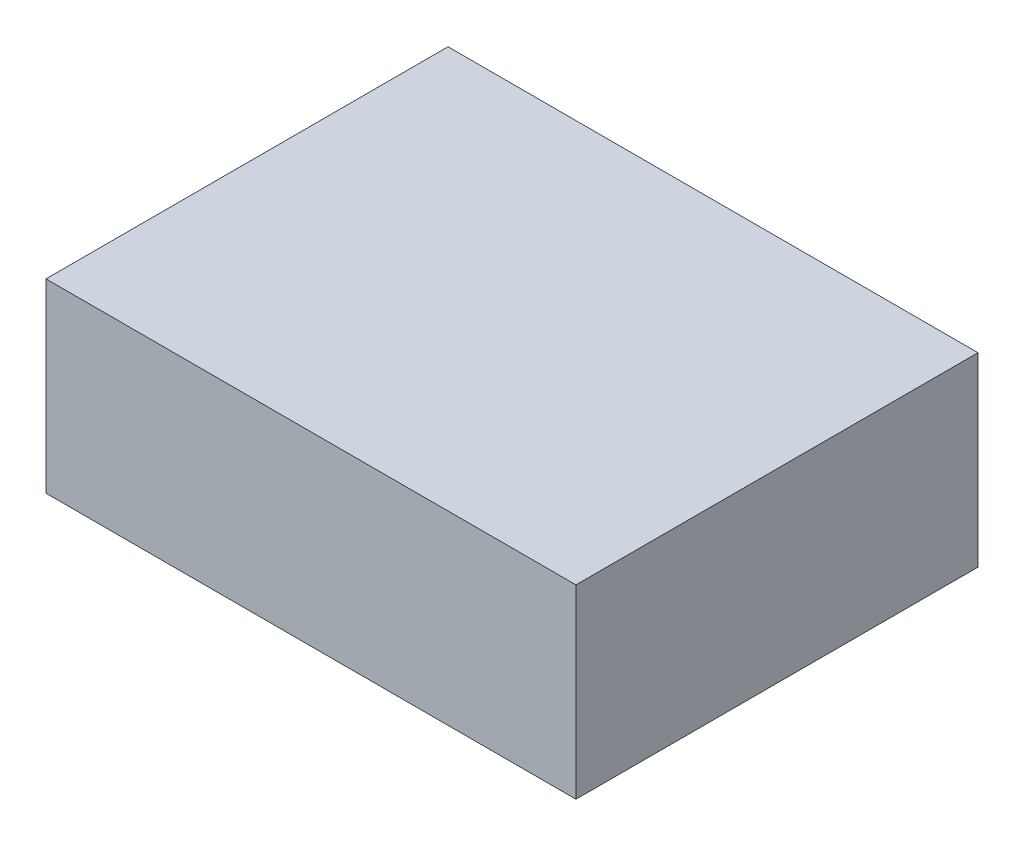
ISO-10303-21;
HEADER;
FILE_DESCRIPTION(('STEP AP214'),'2;1');
FILE_NAME('part.step','',(''),(''),'','','');
FILE_SCHEMA(('AUTOMOTIVE_DESIGN { 1 0 10303 214 1 1 1 1 }'));
ENDSEC;
DATA;
#1=APPLICATION_CONTEXT('core data for automotive mechanical design processes');
#2=APPLICATION_PROTOCOL_DEFINITION('international standard','automotive_design',2000,#1);
#3=PRODUCT_CONTEXT('',#1,'mechanical');
#4=PRODUCT('Part','Part','',(#3));
#5=PRODUCT_RELATED_PRODUCT_CATEGORY('part','',(#4));
#6=PRODUCT_DEFINITION_FORMATION('','',#4);
#7=PRODUCT_DEFINITION_CONTEXT('part definition',#1,'design');
#8=PRODUCT_DEFINITION('design','',#6,#7);
#9=PRODUCT_DEFINITION_SHAPE('','',#8);
#10=(LENGTH_UNIT() NAMED_UNIT(*) SI_UNIT(.MILLI.,.METRE.));
#11=(NAMED_UNIT(*) PLANE_ANGLE_UNIT() SI_UNIT($,.RADIAN.));
#12=(NAMED_UNIT(*) SI_UNIT($,.STERADIAN.) SOLID_ANGLE_UNIT());
#13=UNCERTAINTY_MEASURE_WITH_UNIT(LENGTH_MEASURE(1.E-05),#10,'distance_accuracy_value','');
#14=(GEOMETRIC_REPRESENTATION_CONTEXT(3) GLOBAL_UNCERTAINTY_ASSIGNED_CONTEXT((#13)) GLOBAL_UNIT_ASSIGNED_CONTEXT((#10,
#11,#12)) REPRESENTATION_CONTEXT('',''));
#15=CARTESIAN_POINT('',(0.,0.,0.));
#16=DIRECTION('',(0.,0.,1.));
#17=DIRECTION('',(1.,0.,0.));
#18=AXIS2_PLACEMENT_3D('',#15,#16,#17);
#19=CARTESIAN_POINT('',(-0.72499982,-0.254,0.));
#20=DIRECTION('',(0.,1.,0.));
#21=DIRECTION('',(0.,0.,1.));
#22=AXIS2_PLACEMENT_3D('',#19,#20,#21);
#23=PLANE('',#22);
#24=DIRECTION('',(0.,0.,1.));
#25=VECTOR('',#24,1.);
#26=CARTESIAN_POINT('',(0.72499982,-0.254,0.));
#27=LINE('',#26,#25);
#28=CARTESIAN_POINT('',(0.72499982,-0.254,0.));
#29=VERTEX_POINT('',#28);
#30=CARTESIAN_POINT('',(0.72499982,-0.254,1.10000034));
#31=VERTEX_POINT('',#30);
#32=EDGE_CURVE('E20',#29,#31,#27,.T.);
#33=ORIENTED_EDGE('',*,*,#32,.T.);
#34=DIRECTION('',(-1.,0.,0.));
#35=VECTOR('',#34,1.);
#36=CARTESIAN_POINT('',(0.72499982,-0.254,1.10000034));
#37=LINE('',#36,#35);
#38=CARTESIAN_POINT('',(-0.72499982,-0.254,1.10000034));
#39=VERTEX_POINT('',#38);
#40=EDGE_CURVE('E55',#31,#39,#37,.T.);
#41=ORIENTED_EDGE('',*,*,#40,.T.);
#42=DIRECTION('',(0.,0.,-1.));
#43=VECTOR('',#42,1.);
#44=CARTESIAN_POINT('',(-0.72499982,-0.254,0.));
#45=LINE('',#44,#43);
#46=CARTESIAN_POINT('',(-0.72499982,-0.254,0.));
#47=VERTEX_POINT('',#46);
#48=EDGE_CURVE('E76',#39,#47,#45,.T.);
#49=ORIENTED_EDGE('',*,*,#48,.T.);
#50=DIRECTION('',(-1.,0.,0.));
#51=VECTOR('',#50,1.);
#52=CARTESIAN_POINT('',(0.72499982,-0.254,0.));
#53=LINE('',#52,#51);
#54=EDGE_CURVE('E58',#29,#47,#53,.T.);
#55=ORIENTED_EDGE('',*,*,#54,.F.);
#56=EDGE_LOOP('',(#33,#41,#49,#55));
#57=FACE_BOUND('',#56,.T.);
#58=ADVANCED_FACE('F17',(#57),#23,.F.);
#59=CARTESIAN_POINT('',(0.72499982,-0.254,0.));
#60=DIRECTION('',(-1.,0.,0.));
#61=DIRECTION('',(0.,0.,1.));
#62=AXIS2_PLACEMENT_3D('',#59,#60,#61);
#63=PLANE('',#62);
#64=DIRECTION('',(0.,0.,-1.));
#65=VECTOR('',#64,1.);
#66=CARTESIAN_POINT('',(0.72499982,0.254,0.));
#67=LINE('',#66,#65);
#68=CARTESIAN_POINT('',(0.72499982,0.254,0.));
#69=VERTEX_POINT('',#68);
#70=CARTESIAN_POINT('',(0.72499982,0.254,1.10000034));
#71=VERTEX_POINT('',#70);
#72=EDGE_CURVE('E73',#69,#71,#67,.F.);
#73=ORIENTED_EDGE('',*,*,#72,.T.);
#74=DIRECTION('',(0.,1.,0.));
#75=VECTOR('',#74,1.);
#76=CARTESIAN_POINT('',(0.72499982,0.254,1.10000034));
#77=LINE('',#76,#75);
#78=EDGE_CURVE('E63',#71,#31,#77,.F.);
#79=ORIENTED_EDGE('',*,*,#78,.T.);
#80=ORIENTED_EDGE('',*,*,#32,.F.);
#81=DIRECTION('',(0.,1.,0.));
#82=VECTOR('',#81,1.);
#83=CARTESIAN_POINT('',(0.72499982,0.254,0.));
#84=LINE('',#83,#82);
#85=EDGE_CURVE('E78',#69,#29,#84,.F.);
#86=ORIENTED_EDGE('',*,*,#85,.F.);
#87=EDGE_LOOP('',(#73,#79,#80,#86));
#88=FACE_BOUND('',#87,.T.);
#89=ADVANCED_FACE('F72',(#88),#63,.F.);
#90=CARTESIAN_POINT('',(0.72499982,0.254,1.10000034));
#91=DIRECTION('',(0.,0.,-1.));
#92=DIRECTION('',(-1.,0.,0.));
#93=AXIS2_PLACEMENT_3D('',#90,#91,#92);
#94=PLANE('',#93);
#95=DIRECTION('',(0.,1.,0.));
#96=VECTOR('',#95,1.);
#97=CARTESIAN_POINT('',(-0.72499982,0.254,1.10000034));
#98=LINE('',#97,#96);
#99=CARTESIAN_POINT('',(-0.72499982,0.254,1.10000034));
#100=VERTEX_POINT('',#99);
#101=EDGE_CURVE('E69',#100,#39,#98,.F.);
#102=ORIENTED_EDGE('',*,*,#101,.T.);
#103=ORIENTED_EDGE('',*,*,#40,.F.);
#104=ORIENTED_EDGE('',*,*,#78,.F.);
#105=DIRECTION('',(1.,0.,0.));
#106=VECTOR('',#105,1.);
#107=CARTESIAN_POINT('',(0.72499982,0.254,1.10000034));
#108=LINE('',#107,#106);
#109=EDGE_CURVE('E83',#71,#100,#108,.F.);
#110=ORIENTED_EDGE('',*,*,#109,.T.);
#111=EDGE_LOOP('',(#102,#103,#104,#110));
#112=FACE_BOUND('',#111,.T.);
#113=ADVANCED_FACE('F66',(#112),#94,.F.);
#114=CARTESIAN_POINT('',(-0.72499982,0.254,0.));
#115=DIRECTION('',(1.,0.,0.));
#116=DIRECTION('',(0.,0.,-1.));
#117=AXIS2_PLACEMENT_3D('',#114,#115,#116);
#118=PLANE('',#117);
#119=ORIENTED_EDGE('',*,*,#48,.F.);
#120=ORIENTED_EDGE('',*,*,#101,.F.);
#121=DIRECTION('',(0.,0.,-1.));
#122=VECTOR('',#121,1.);
#123=CARTESIAN_POINT('',(-0.72499982,0.254,0.));
#124=LINE('',#123,#122);
#125=CARTESIAN_POINT('',(-0.72499982,0.254,0.));
#126=VERTEX_POINT('',#125);
#127=EDGE_CURVE('E26',#100,#126,#124,.T.);
#128=ORIENTED_EDGE('',*,*,#127,.T.);
#129=DIRECTION('',(0.,1.,0.));
#130=VECTOR('',#129,1.);
#131=CARTESIAN_POINT('',(-0.72499982,0.254,0.));
#132=LINE('',#131,#130);
#133=EDGE_CURVE('E34',#47,#126,#132,.T.);
#134=ORIENTED_EDGE('',*,*,#133,.F.);
#135=EDGE_LOOP('',(#119,#120,#128,#134));
#136=FACE_BOUND('',#135,.T.);
#137=ADVANCED_FACE('F88',(#136),#118,.F.);
#138=CARTESIAN_POINT('',(0.72499982,0.254,0.));
#139=DIRECTION('',(0.,0.,-1.));
#140=DIRECTION('',(-1.,0.,0.));
#141=AXIS2_PLACEMENT_3D('',#138,#139,#140);
#142=PLANE('',#141);
#143=ORIENTED_EDGE('',*,*,#133,.T.);
#144=DIRECTION('',(1.,0.,0.));
#145=VECTOR('',#144,1.);
#146=CARTESIAN_POINT('',(0.72499982,0.254,0.));
#147=LINE('',#146,#145);
#148=EDGE_CURVE('E11',#126,#69,#147,.T.);
#149=ORIENTED_EDGE('',*,*,#148,.T.);
#150=ORIENTED_EDGE('',*,*,#85,.T.);
#151=ORIENTED_EDGE('',*,*,#54,.T.);
#152=EDGE_LOOP('',(#143,#149,#150,#151));
#153=FACE_BOUND('',#152,.T.);
#154=ADVANCED_FACE('F91',(#153),#142,.T.);
#155=CARTESIAN_POINT('',(0.72499982,0.254,0.));
#156=DIRECTION('',(0.,-1.,0.));
#157=DIRECTION('',(0.,0.,-1.));
#158=AXIS2_PLACEMENT_3D('',#155,#156,#157);
#159=PLANE('',#158);
#160=ORIENTED_EDGE('',*,*,#127,.F.);
#161=ORIENTED_EDGE('',*,*,#109,.F.);
#162=ORIENTED_EDGE('',*,*,#72,.F.);
#163=ORIENTED_EDGE('',*,*,#148,.F.);
#164=EDGE_LOOP('',(#160,#161,#162,#163));
#165=FACE_BOUND('',#164,.T.);
#166=ADVANCED_FACE('F90',(#165),#159,.F.);
#167=CLOSED_SHELL('',(#58,#89,#113,#137,#154,#166));
#168=MANIFOLD_SOLID_BREP('B1',#167);
#169=ADVANCED_BREP_SHAPE_REPRESENTATION('',(#18,#168),#14);
#170=SHAPE_DEFINITION_REPRESENTATION(#9,#169);
ENDSEC;
END-ISO-10303-21;
